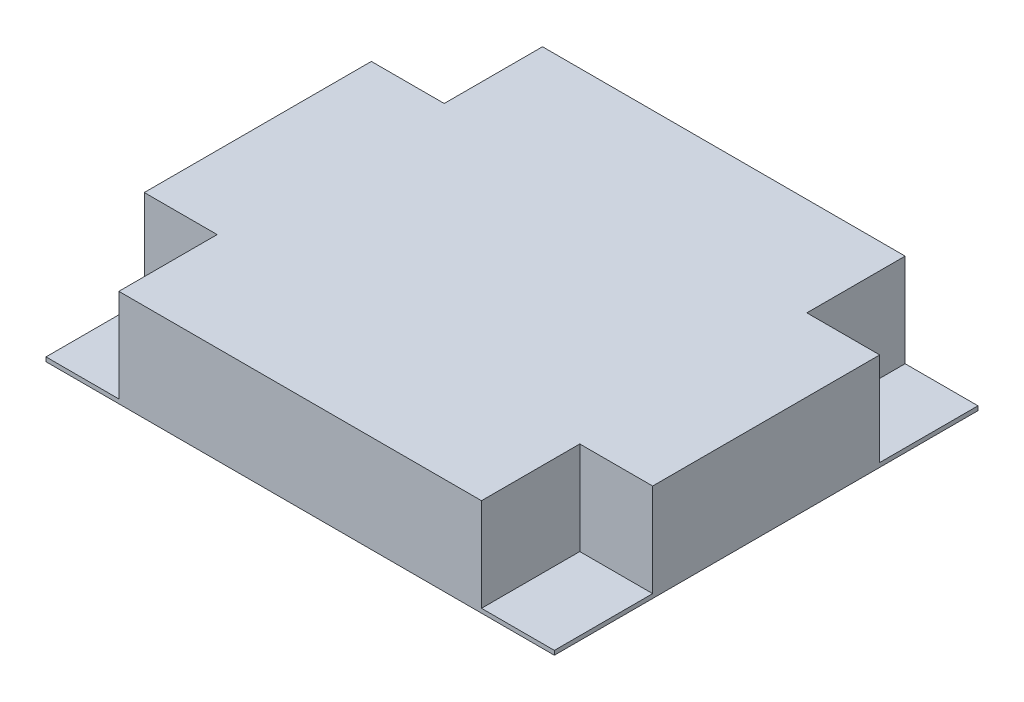
ISO-10303-21;
HEADER;
FILE_DESCRIPTION(('STEP AP214'),'2;1');
FILE_NAME('part.step','',(''),(''),'','','');
FILE_SCHEMA(('AUTOMOTIVE_DESIGN { 1 0 10303 214 1 1 1 1 }'));
ENDSEC;
DATA;
#1=APPLICATION_CONTEXT('core data for automotive mechanical design processes');
#2=APPLICATION_PROTOCOL_DEFINITION('international standard','automotive_design',2000,#1);
#3=PRODUCT_CONTEXT('',#1,'mechanical');
#4=PRODUCT('Part','Part','',(#3));
#5=PRODUCT_RELATED_PRODUCT_CATEGORY('part','',(#4));
#6=PRODUCT_DEFINITION_FORMATION('','',#4);
#7=PRODUCT_DEFINITION_CONTEXT('part definition',#1,'design');
#8=PRODUCT_DEFINITION('design','',#6,#7);
#9=PRODUCT_DEFINITION_SHAPE('','',#8);
#10=(LENGTH_UNIT() NAMED_UNIT(*) SI_UNIT(.MILLI.,.METRE.));
#11=(NAMED_UNIT(*) PLANE_ANGLE_UNIT() SI_UNIT($,.RADIAN.));
#12=(NAMED_UNIT(*) SI_UNIT($,.STERADIAN.) SOLID_ANGLE_UNIT());
#13=UNCERTAINTY_MEASURE_WITH_UNIT(LENGTH_MEASURE(1.E-05),#10,'distance_accuracy_value','');
#14=(GEOMETRIC_REPRESENTATION_CONTEXT(3) GLOBAL_UNCERTAINTY_ASSIGNED_CONTEXT((#13)) GLOBAL_UNIT_ASSIGNED_CONTEXT((#10,
#11,#12)) REPRESENTATION_CONTEXT('',''));
#15=CARTESIAN_POINT('',(0.,0.,0.));
#16=DIRECTION('',(0.,0.,1.));
#17=DIRECTION('',(1.,0.,0.));
#18=AXIS2_PLACEMENT_3D('',#15,#16,#17);
#19=CARTESIAN_POINT('',(0.,115.,500.));
#20=DIRECTION('',(0.,0.,-1.));
#21=DIRECTION('',(-1.,0.,0.));
#22=AXIS2_PLACEMENT_3D('',#19,#20,#21);
#23=PLANE('',#22);
#24=DIRECTION('',(1.,0.,0.));
#25=VECTOR('',#24,1.);
#26=CARTESIAN_POINT('',(600.,5.,500.));
#27=LINE('',#26,#25);
#28=CARTESIAN_POINT('',(514.,5.,500.));
#29=VERTEX_POINT('',#28);
#30=CARTESIAN_POINT('',(600.,5.,500.));
#31=VERTEX_POINT('',#30);
#32=EDGE_CURVE('E206',#29,#31,#27,.T.);
#33=ORIENTED_EDGE('',*,*,#32,.F.);
#34=DIRECTION('',(0.,1.,0.));
#35=VECTOR('',#34,1.);
#36=CARTESIAN_POINT('',(514.,5.,500.));
#37=LINE('',#36,#35);
#38=CARTESIAN_POINT('',(514.,115.,500.));
#39=VERTEX_POINT('',#38);
#40=EDGE_CURVE('E187',#29,#39,#37,.T.);
#41=ORIENTED_EDGE('',*,*,#40,.T.);
#42=DIRECTION('',(1.,0.,0.));
#43=VECTOR('',#42,1.);
#44=CARTESIAN_POINT('',(0.,115.,500.));
#45=LINE('',#44,#43);
#46=CARTESIAN_POINT('',(86.,115.,500.));
#47=VERTEX_POINT('',#46);
#48=EDGE_CURVE('E241',#47,#39,#45,.T.);
#49=ORIENTED_EDGE('',*,*,#48,.F.);
#50=DIRECTION('',(0.,1.,0.));
#51=VECTOR('',#50,1.);
#52=CARTESIAN_POINT('',(86.,5.,500.));
#53=LINE('',#52,#51);
#54=CARTESIAN_POINT('',(86.,5.,500.));
#55=VERTEX_POINT('',#54);
#56=EDGE_CURVE('E230',#55,#47,#53,.T.);
#57=ORIENTED_EDGE('',*,*,#56,.F.);
#58=DIRECTION('',(1.,0.,0.));
#59=VECTOR('',#58,1.);
#60=CARTESIAN_POINT('',(0.,5.,500.));
#61=LINE('',#60,#59);
#62=CARTESIAN_POINT('',(0.,5.,500.));
#63=VERTEX_POINT('',#62);
#64=EDGE_CURVE('E220',#63,#55,#61,.T.);
#65=ORIENTED_EDGE('',*,*,#64,.F.);
#66=DIRECTION('',(0.,-1.,0.));
#67=VECTOR('',#66,1.);
#68=CARTESIAN_POINT('',(0.,115.,500.));
#69=LINE('',#68,#67);
#70=CARTESIAN_POINT('',(0.,0.,500.));
#71=VERTEX_POINT('',#70);
#72=EDGE_CURVE('E252',#63,#71,#69,.T.);
#73=ORIENTED_EDGE('',*,*,#72,.T.);
#74=DIRECTION('',(1.,0.,0.));
#75=VECTOR('',#74,1.);
#76=CARTESIAN_POINT('',(0.,0.,500.));
#77=LINE('',#76,#75);
#78=CARTESIAN_POINT('',(600.,0.,500.));
#79=VERTEX_POINT('',#78);
#80=EDGE_CURVE('E237',#71,#79,#77,.T.);
#81=ORIENTED_EDGE('',*,*,#80,.T.);
#82=DIRECTION('',(0.,-1.,0.));
#83=VECTOR('',#82,1.);
#84=CARTESIAN_POINT('',(600.,115.,500.));
#85=LINE('',#84,#83);
#86=EDGE_CURVE('E11',#31,#79,#85,.T.);
#87=ORIENTED_EDGE('',*,*,#86,.F.);
#88=EDGE_LOOP('',(#33,#41,#49,#57,#65,#73,#81,#87));
#89=FACE_BOUND('',#88,.T.);
#90=ADVANCED_FACE('F33',(#89),#23,.F.);
#91=CARTESIAN_POINT('',(600.,115.,0.));
#92=DIRECTION('',(1.,0.,0.));
#93=DIRECTION('',(0.,0.,-1.));
#94=AXIS2_PLACEMENT_3D('',#91,#92,#93);
#95=PLANE('',#94);
#96=DIRECTION('',(0.,1.,0.));
#97=VECTOR('',#96,1.);
#98=CARTESIAN_POINT('',(600.,5.,384.));
#99=LINE('',#98,#97);
#100=CARTESIAN_POINT('',(600.,5.,384.));
#101=VERTEX_POINT('',#100);
#102=CARTESIAN_POINT('',(600.,115.,384.));
#103=VERTEX_POINT('',#102);
#104=EDGE_CURVE('E208',#101,#103,#99,.T.);
#105=ORIENTED_EDGE('',*,*,#104,.F.);
#106=DIRECTION('',(0.,0.,-1.));
#107=VECTOR('',#106,1.);
#108=CARTESIAN_POINT('',(600.,5.,500.));
#109=LINE('',#108,#107);
#110=EDGE_CURVE('E196',#31,#101,#109,.T.);
#111=ORIENTED_EDGE('',*,*,#110,.F.);
#112=ORIENTED_EDGE('',*,*,#86,.T.);
#113=DIRECTION('',(0.,0.,1.));
#114=VECTOR('',#113,1.);
#115=CARTESIAN_POINT('',(600.,0.,0.));
#116=LINE('',#115,#114);
#117=CARTESIAN_POINT('',(600.,0.,0.));
#118=VERTEX_POINT('',#117);
#119=EDGE_CURVE('E255',#118,#79,#116,.T.);
#120=ORIENTED_EDGE('',*,*,#119,.F.);
#121=DIRECTION('',(0.,-1.,0.));
#122=VECTOR('',#121,1.);
#123=CARTESIAN_POINT('',(600.,115.,0.));
#124=LINE('',#123,#122);
#125=CARTESIAN_POINT('',(600.,5.,0.));
#126=VERTEX_POINT('',#125);
#127=EDGE_CURVE('E40',#126,#118,#124,.T.);
#128=ORIENTED_EDGE('',*,*,#127,.F.);
#129=DIRECTION('',(0.,0.,-1.));
#130=VECTOR('',#129,1.);
#131=CARTESIAN_POINT('',(600.,5.,0.));
#132=LINE('',#131,#130);
#133=CARTESIAN_POINT('',(600.,5.,116.));
#134=VERTEX_POINT('',#133);
#135=EDGE_CURVE('E183',#134,#126,#132,.T.);
#136=ORIENTED_EDGE('',*,*,#135,.F.);
#137=DIRECTION('',(0.,1.,0.));
#138=VECTOR('',#137,1.);
#139=CARTESIAN_POINT('',(600.,5.,116.));
#140=LINE('',#139,#138);
#141=CARTESIAN_POINT('',(600.,115.,116.));
#142=VERTEX_POINT('',#141);
#143=EDGE_CURVE('E189',#134,#142,#140,.T.);
#144=ORIENTED_EDGE('',*,*,#143,.T.);
#145=DIRECTION('',(0.,0.,1.));
#146=VECTOR('',#145,1.);
#147=CARTESIAN_POINT('',(600.,115.,0.));
#148=LINE('',#147,#146);
#149=EDGE_CURVE('E244',#142,#103,#148,.T.);
#150=ORIENTED_EDGE('',*,*,#149,.T.);
#151=EDGE_LOOP('',(#105,#111,#112,#120,#128,#136,#144,#150));
#152=FACE_BOUND('',#151,.T.);
#153=ADVANCED_FACE('F274',(#152),#95,.T.);
#154=CARTESIAN_POINT('',(0.,115.,0.));
#155=DIRECTION('',(0.,0.,-1.));
#156=DIRECTION('',(-1.,0.,0.));
#157=AXIS2_PLACEMENT_3D('',#154,#155,#156);
#158=PLANE('',#157);
#159=DIRECTION('',(0.,1.,0.));
#160=VECTOR('',#159,1.);
#161=CARTESIAN_POINT('',(514.,5.,1.11022302462516E-13));
#162=LINE('',#161,#160);
#163=CARTESIAN_POINT('',(514.,5.,1.11022302462516E-13));
#164=VERTEX_POINT('',#163);
#165=CARTESIAN_POINT('',(514.,115.,0.));
#166=VERTEX_POINT('',#165);
#167=EDGE_CURVE('E55',#164,#166,#162,.T.);
#168=ORIENTED_EDGE('',*,*,#167,.F.);
#169=DIRECTION('',(-1.,0.,0.));
#170=VECTOR('',#169,1.);
#171=CARTESIAN_POINT('',(600.,5.,0.));
#172=LINE('',#171,#170);
#173=EDGE_CURVE('E173',#126,#164,#172,.T.);
#174=ORIENTED_EDGE('',*,*,#173,.F.);
#175=ORIENTED_EDGE('',*,*,#127,.T.);
#176=DIRECTION('',(1.,0.,0.));
#177=VECTOR('',#176,1.);
#178=CARTESIAN_POINT('',(0.,0.,0.));
#179=LINE('',#178,#177);
#180=CARTESIAN_POINT('',(0.,0.,0.));
#181=VERTEX_POINT('',#180);
#182=EDGE_CURVE('E258',#181,#118,#179,.T.);
#183=ORIENTED_EDGE('',*,*,#182,.F.);
#184=DIRECTION('',(0.,-1.,0.));
#185=VECTOR('',#184,1.);
#186=CARTESIAN_POINT('',(0.,115.,0.));
#187=LINE('',#186,#185);
#188=CARTESIAN_POINT('',(0.,5.,0.));
#189=VERTEX_POINT('',#188);
#190=EDGE_CURVE('E264',#189,#181,#187,.T.);
#191=ORIENTED_EDGE('',*,*,#190,.F.);
#192=DIRECTION('',(-1.,0.,0.));
#193=VECTOR('',#192,1.);
#194=CARTESIAN_POINT('',(0.,5.,0.));
#195=LINE('',#194,#193);
#196=CARTESIAN_POINT('',(86.,5.,1.11022302462516E-13));
#197=VERTEX_POINT('',#196);
#198=EDGE_CURVE('E157',#197,#189,#195,.T.);
#199=ORIENTED_EDGE('',*,*,#198,.F.);
#200=DIRECTION('',(0.,1.,0.));
#201=VECTOR('',#200,1.);
#202=CARTESIAN_POINT('',(86.,5.,1.11022302462516E-13));
#203=LINE('',#202,#201);
#204=CARTESIAN_POINT('',(86.,115.,1.11022302462516E-13));
#205=VERTEX_POINT('',#204);
#206=EDGE_CURVE('E168',#197,#205,#203,.T.);
#207=ORIENTED_EDGE('',*,*,#206,.T.);
#208=DIRECTION('',(1.,0.,0.));
#209=VECTOR('',#208,1.);
#210=CARTESIAN_POINT('',(0.,115.,0.));
#211=LINE('',#210,#209);
#212=EDGE_CURVE('E248',#205,#166,#211,.T.);
#213=ORIENTED_EDGE('',*,*,#212,.T.);
#214=EDGE_LOOP('',(#168,#174,#175,#183,#191,#199,#207,#213));
#215=FACE_BOUND('',#214,.T.);
#216=ADVANCED_FACE('F270',(#215),#158,.T.);
#217=CARTESIAN_POINT('',(0.,115.,0.));
#218=DIRECTION('',(1.,0.,0.));
#219=DIRECTION('',(0.,0.,-1.));
#220=AXIS2_PLACEMENT_3D('',#217,#218,#219);
#221=PLANE('',#220);
#222=DIRECTION('',(0.,0.,1.));
#223=VECTOR('',#222,1.);
#224=CARTESIAN_POINT('',(0.,115.,0.));
#225=LINE('',#224,#223);
#226=CARTESIAN_POINT('',(0.,115.,116.));
#227=VERTEX_POINT('',#226);
#228=CARTESIAN_POINT('',(0.,115.,384.));
#229=VERTEX_POINT('',#228);
#230=EDGE_CURVE('E166',#227,#229,#225,.T.);
#231=ORIENTED_EDGE('',*,*,#230,.F.);
#232=DIRECTION('',(0.,1.,0.));
#233=VECTOR('',#232,1.);
#234=CARTESIAN_POINT('',(0.,5.,116.));
#235=LINE('',#234,#233);
#236=CARTESIAN_POINT('',(0.,5.,116.));
#237=VERTEX_POINT('',#236);
#238=EDGE_CURVE('E47',#237,#227,#235,.T.);
#239=ORIENTED_EDGE('',*,*,#238,.F.);
#240=DIRECTION('',(0.,0.,1.));
#241=VECTOR('',#240,1.);
#242=CARTESIAN_POINT('',(0.,5.,0.));
#243=LINE('',#242,#241);
#244=EDGE_CURVE('E152',#189,#237,#243,.T.);
#245=ORIENTED_EDGE('',*,*,#244,.F.);
#246=ORIENTED_EDGE('',*,*,#190,.T.);
#247=DIRECTION('',(0.,0.,1.));
#248=VECTOR('',#247,1.);
#249=CARTESIAN_POINT('',(0.,0.,0.));
#250=LINE('',#249,#248);
#251=EDGE_CURVE('E245',#181,#71,#250,.T.);
#252=ORIENTED_EDGE('',*,*,#251,.T.);
#253=ORIENTED_EDGE('',*,*,#72,.F.);
#254=DIRECTION('',(0.,0.,1.));
#255=VECTOR('',#254,1.);
#256=CARTESIAN_POINT('',(0.,5.,500.));
#257=LINE('',#256,#255);
#258=CARTESIAN_POINT('',(0.,5.,384.));
#259=VERTEX_POINT('',#258);
#260=EDGE_CURVE('E218',#259,#63,#257,.T.);
#261=ORIENTED_EDGE('',*,*,#260,.F.);
#262=DIRECTION('',(0.,1.,0.));
#263=VECTOR('',#262,1.);
#264=CARTESIAN_POINT('',(0.,5.,384.));
#265=LINE('',#264,#263);
#266=EDGE_CURVE('E235',#259,#229,#265,.T.);
#267=ORIENTED_EDGE('',*,*,#266,.T.);
#268=EDGE_LOOP('',(#231,#239,#245,#246,#252,#253,#261,#267));
#269=FACE_BOUND('',#268,.T.);
#270=ADVANCED_FACE('F163',(#269),#221,.F.);
#271=CARTESIAN_POINT('',(0.,115.,0.));
#272=DIRECTION('',(0.,-1.,0.));
#273=DIRECTION('',(0.,0.,-1.));
#274=AXIS2_PLACEMENT_3D('',#271,#272,#273);
#275=PLANE('',#274);
#276=ORIENTED_EDGE('',*,*,#48,.T.);
#277=DIRECTION('',(0.,0.,1.));
#278=VECTOR('',#277,1.);
#279=CARTESIAN_POINT('',(514.,115.,500.));
#280=LINE('',#279,#278);
#281=CARTESIAN_POINT('',(514.,115.,384.));
#282=VERTEX_POINT('',#281);
#283=EDGE_CURVE('E200',#282,#39,#280,.T.);
#284=ORIENTED_EDGE('',*,*,#283,.F.);
#285=DIRECTION('',(-1.,0.,0.));
#286=VECTOR('',#285,1.);
#287=CARTESIAN_POINT('',(600.,115.,384.));
#288=LINE('',#287,#286);
#289=EDGE_CURVE('E209',#103,#282,#288,.T.);
#290=ORIENTED_EDGE('',*,*,#289,.F.);
#291=ORIENTED_EDGE('',*,*,#149,.F.);
#292=DIRECTION('',(1.,0.,0.));
#293=VECTOR('',#292,1.);
#294=CARTESIAN_POINT('',(600.,115.,116.));
#295=LINE('',#294,#293);
#296=CARTESIAN_POINT('',(514.,115.,116.));
#297=VERTEX_POINT('',#296);
#298=EDGE_CURVE('E177',#297,#142,#295,.T.);
#299=ORIENTED_EDGE('',*,*,#298,.F.);
#300=DIRECTION('',(0.,0.,1.));
#301=VECTOR('',#300,1.);
#302=CARTESIAN_POINT('',(514.,115.,1.11022302462516E-13));
#303=LINE('',#302,#301);
#304=EDGE_CURVE('E185',#166,#297,#303,.T.);
#305=ORIENTED_EDGE('',*,*,#304,.F.);
#306=ORIENTED_EDGE('',*,*,#212,.F.);
#307=DIRECTION('',(0.,0.,-1.));
#308=VECTOR('',#307,1.);
#309=CARTESIAN_POINT('',(86.,115.,1.11022302462516E-13));
#310=LINE('',#309,#308);
#311=CARTESIAN_POINT('',(86.,115.,116.));
#312=VERTEX_POINT('',#311);
#313=EDGE_CURVE('E160',#312,#205,#310,.T.);
#314=ORIENTED_EDGE('',*,*,#313,.F.);
#315=DIRECTION('',(1.,0.,0.));
#316=VECTOR('',#315,1.);
#317=CARTESIAN_POINT('',(0.,115.,116.));
#318=LINE('',#317,#316);
#319=EDGE_CURVE('E192',#227,#312,#318,.T.);
#320=ORIENTED_EDGE('',*,*,#319,.F.);
#321=ORIENTED_EDGE('',*,*,#230,.T.);
#322=DIRECTION('',(-1.,0.,0.));
#323=VECTOR('',#322,1.);
#324=CARTESIAN_POINT('',(0.,115.,384.));
#325=LINE('',#324,#323);
#326=CARTESIAN_POINT('',(86.,115.,384.));
#327=VERTEX_POINT('',#326);
#328=EDGE_CURVE('E221',#327,#229,#325,.T.);
#329=ORIENTED_EDGE('',*,*,#328,.F.);
#330=DIRECTION('',(0.,0.,-1.));
#331=VECTOR('',#330,1.);
#332=CARTESIAN_POINT('',(86.,115.,500.));
#333=LINE('',#332,#331);
#334=EDGE_CURVE('E231',#47,#327,#333,.T.);
#335=ORIENTED_EDGE('',*,*,#334,.F.);
#336=EDGE_LOOP('',(#276,#284,#290,#291,#299,#305,#306,#314,#320,#321,#329,#335));
#337=FACE_BOUND('',#336,.T.);
#338=ADVANCED_FACE('F288',(#337),#275,.F.);
#339=CARTESIAN_POINT('',(0.,0.,0.));
#340=DIRECTION('',(0.,-1.,0.));
#341=DIRECTION('',(0.,0.,-1.));
#342=AXIS2_PLACEMENT_3D('',#339,#340,#341);
#343=PLANE('',#342);
#344=ORIENTED_EDGE('',*,*,#80,.F.);
#345=ORIENTED_EDGE('',*,*,#251,.F.);
#346=ORIENTED_EDGE('',*,*,#182,.T.);
#347=ORIENTED_EDGE('',*,*,#119,.T.);
#348=EDGE_LOOP('',(#344,#345,#346,#347));
#349=FACE_BOUND('',#348,.T.);
#350=ADVANCED_FACE('F280',(#349),#343,.T.);
#351=CARTESIAN_POINT('',(0.,5.,384.));
#352=DIRECTION('',(0.,0.,-1.));
#353=DIRECTION('',(-1.,0.,0.));
#354=AXIS2_PLACEMENT_3D('',#351,#352,#353);
#355=PLANE('',#354);
#356=ORIENTED_EDGE('',*,*,#328,.T.);
#357=ORIENTED_EDGE('',*,*,#266,.F.);
#358=DIRECTION('',(-1.,0.,0.));
#359=VECTOR('',#358,1.);
#360=CARTESIAN_POINT('',(0.,5.,384.));
#361=LINE('',#360,#359);
#362=CARTESIAN_POINT('',(86.,5.,384.));
#363=VERTEX_POINT('',#362);
#364=EDGE_CURVE('E227',#363,#259,#361,.T.);
#365=ORIENTED_EDGE('',*,*,#364,.F.);
#366=DIRECTION('',(0.,1.,0.));
#367=VECTOR('',#366,1.);
#368=CARTESIAN_POINT('',(86.,5.,384.));
#369=LINE('',#368,#367);
#370=EDGE_CURVE('E238',#363,#327,#369,.T.);
#371=ORIENTED_EDGE('',*,*,#370,.T.);
#372=EDGE_LOOP('',(#356,#357,#365,#371));
#373=FACE_BOUND('',#372,.T.);
#374=ADVANCED_FACE('F341',(#373),#355,.F.);
#375=CARTESIAN_POINT('',(86.,5.,500.));
#376=DIRECTION('',(1.,0.,0.));
#377=DIRECTION('',(0.,0.,-1.));
#378=AXIS2_PLACEMENT_3D('',#375,#376,#377);
#379=PLANE('',#378);
#380=ORIENTED_EDGE('',*,*,#334,.T.);
#381=ORIENTED_EDGE('',*,*,#370,.F.);
#382=DIRECTION('',(0.,0.,-1.));
#383=VECTOR('',#382,1.);
#384=CARTESIAN_POINT('',(86.,5.,500.));
#385=LINE('',#384,#383);
#386=EDGE_CURVE('E224',#55,#363,#385,.T.);
#387=ORIENTED_EDGE('',*,*,#386,.F.);
#388=ORIENTED_EDGE('',*,*,#56,.T.);
#389=EDGE_LOOP('',(#380,#381,#387,#388));
#390=FACE_BOUND('',#389,.T.);
#391=ADVANCED_FACE('F325',(#390),#379,.F.);
#392=CARTESIAN_POINT('',(0.,5.,0.));
#393=DIRECTION('',(0.,-1.,0.));
#394=DIRECTION('',(0.,0.,-1.));
#395=AXIS2_PLACEMENT_3D('',#392,#393,#394);
#396=PLANE('',#395);
#397=ORIENTED_EDGE('',*,*,#260,.T.);
#398=ORIENTED_EDGE('',*,*,#64,.T.);
#399=ORIENTED_EDGE('',*,*,#386,.T.);
#400=ORIENTED_EDGE('',*,*,#364,.T.);
#401=EDGE_LOOP('',(#397,#398,#399,#400));
#402=FACE_BOUND('',#401,.T.);
#403=ADVANCED_FACE('F309',(#402),#396,.F.);
#404=CARTESIAN_POINT('',(86.,5.,1.11022302462516E-13));
#405=DIRECTION('',(1.,0.,0.));
#406=DIRECTION('',(0.,0.,-1.));
#407=AXIS2_PLACEMENT_3D('',#404,#405,#406);
#408=PLANE('',#407);
#409=ORIENTED_EDGE('',*,*,#313,.T.);
#410=ORIENTED_EDGE('',*,*,#206,.F.);
#411=DIRECTION('',(0.,0.,-1.));
#412=VECTOR('',#411,1.);
#413=CARTESIAN_POINT('',(86.,5.,1.11022302462516E-13));
#414=LINE('',#413,#412);
#415=CARTESIAN_POINT('',(86.,5.,116.));
#416=VERTEX_POINT('',#415);
#417=EDGE_CURVE('E151',#416,#197,#414,.T.);
#418=ORIENTED_EDGE('',*,*,#417,.F.);
#419=DIRECTION('',(0.,1.,0.));
#420=VECTOR('',#419,1.);
#421=CARTESIAN_POINT('',(86.,5.,116.));
#422=LINE('',#421,#420);
#423=EDGE_CURVE('E147',#416,#312,#422,.T.);
#424=ORIENTED_EDGE('',*,*,#423,.T.);
#425=EDGE_LOOP('',(#409,#410,#418,#424));
#426=FACE_BOUND('',#425,.T.);
#427=ADVANCED_FACE('F317',(#426),#408,.F.);
#428=CARTESIAN_POINT('',(0.,5.,116.));
#429=DIRECTION('',(0.,0.,1.));
#430=DIRECTION('',(1.,0.,0.));
#431=AXIS2_PLACEMENT_3D('',#428,#429,#430);
#432=PLANE('',#431);
#433=ORIENTED_EDGE('',*,*,#319,.T.);
#434=ORIENTED_EDGE('',*,*,#423,.F.);
#435=DIRECTION('',(1.,0.,0.));
#436=VECTOR('',#435,1.);
#437=CARTESIAN_POINT('',(0.,5.,116.));
#438=LINE('',#437,#436);
#439=EDGE_CURVE('E144',#237,#416,#438,.T.);
#440=ORIENTED_EDGE('',*,*,#439,.F.);
#441=ORIENTED_EDGE('',*,*,#238,.T.);
#442=EDGE_LOOP('',(#433,#434,#440,#441));
#443=FACE_BOUND('',#442,.T.);
#444=ADVANCED_FACE('F146',(#443),#432,.F.);
#445=CARTESIAN_POINT('',(0.,5.,0.));
#446=DIRECTION('',(0.,1.,0.));
#447=DIRECTION('',(0.,0.,1.));
#448=AXIS2_PLACEMENT_3D('',#445,#446,#447);
#449=PLANE('',#448);
#450=ORIENTED_EDGE('',*,*,#244,.T.);
#451=ORIENTED_EDGE('',*,*,#439,.T.);
#452=ORIENTED_EDGE('',*,*,#417,.T.);
#453=ORIENTED_EDGE('',*,*,#198,.T.);
#454=EDGE_LOOP('',(#450,#451,#452,#453));
#455=FACE_BOUND('',#454,.T.);
#456=ADVANCED_FACE('F155',(#455),#449,.T.);
#457=CARTESIAN_POINT('',(600.,5.,116.));
#458=DIRECTION('',(0.,0.,1.));
#459=DIRECTION('',(1.,0.,0.));
#460=AXIS2_PLACEMENT_3D('',#457,#458,#459);
#461=PLANE('',#460);
#462=ORIENTED_EDGE('',*,*,#298,.T.);
#463=ORIENTED_EDGE('',*,*,#143,.F.);
#464=DIRECTION('',(1.,0.,0.));
#465=VECTOR('',#464,1.);
#466=CARTESIAN_POINT('',(600.,5.,116.));
#467=LINE('',#466,#465);
#468=CARTESIAN_POINT('',(514.,5.,116.));
#469=VERTEX_POINT('',#468);
#470=EDGE_CURVE('E180',#469,#134,#467,.T.);
#471=ORIENTED_EDGE('',*,*,#470,.F.);
#472=DIRECTION('',(0.,1.,0.));
#473=VECTOR('',#472,1.);
#474=CARTESIAN_POINT('',(514.,5.,116.));
#475=LINE('',#474,#473);
#476=EDGE_CURVE('E193',#469,#297,#475,.T.);
#477=ORIENTED_EDGE('',*,*,#476,.T.);
#478=EDGE_LOOP('',(#462,#463,#471,#477));
#479=FACE_BOUND('',#478,.T.);
#480=ADVANCED_FACE('F294',(#479),#461,.F.);
#481=CARTESIAN_POINT('',(514.,5.,1.11022302462516E-13));
#482=DIRECTION('',(-1.,0.,0.));
#483=DIRECTION('',(0.,0.,1.));
#484=AXIS2_PLACEMENT_3D('',#481,#482,#483);
#485=PLANE('',#484);
#486=ORIENTED_EDGE('',*,*,#304,.T.);
#487=ORIENTED_EDGE('',*,*,#476,.F.);
#488=DIRECTION('',(0.,0.,1.));
#489=VECTOR('',#488,1.);
#490=CARTESIAN_POINT('',(514.,5.,1.11022302462516E-13));
#491=LINE('',#490,#489);
#492=EDGE_CURVE('E176',#164,#469,#491,.T.);
#493=ORIENTED_EDGE('',*,*,#492,.F.);
#494=ORIENTED_EDGE('',*,*,#167,.T.);
#495=EDGE_LOOP('',(#486,#487,#493,#494));
#496=FACE_BOUND('',#495,.T.);
#497=ADVANCED_FACE('F291',(#496),#485,.F.);
#498=CARTESIAN_POINT('',(0.,5.,0.));
#499=DIRECTION('',(0.,1.,0.));
#500=DIRECTION('',(0.,0.,1.));
#501=AXIS2_PLACEMENT_3D('',#498,#499,#500);
#502=PLANE('',#501);
#503=ORIENTED_EDGE('',*,*,#173,.T.);
#504=ORIENTED_EDGE('',*,*,#492,.T.);
#505=ORIENTED_EDGE('',*,*,#470,.T.);
#506=ORIENTED_EDGE('',*,*,#135,.T.);
#507=EDGE_LOOP('',(#503,#504,#505,#506));
#508=FACE_BOUND('',#507,.T.);
#509=ADVANCED_FACE('F296',(#508),#502,.T.);
#510=CARTESIAN_POINT('',(514.,5.,500.));
#511=DIRECTION('',(-1.,0.,0.));
#512=DIRECTION('',(0.,0.,1.));
#513=AXIS2_PLACEMENT_3D('',#510,#511,#512);
#514=PLANE('',#513);
#515=ORIENTED_EDGE('',*,*,#283,.T.);
#516=ORIENTED_EDGE('',*,*,#40,.F.);
#517=DIRECTION('',(0.,0.,1.));
#518=VECTOR('',#517,1.);
#519=CARTESIAN_POINT('',(514.,5.,500.));
#520=LINE('',#519,#518);
#521=CARTESIAN_POINT('',(514.,5.,384.));
#522=VERTEX_POINT('',#521);
#523=EDGE_CURVE('E203',#522,#29,#520,.T.);
#524=ORIENTED_EDGE('',*,*,#523,.F.);
#525=DIRECTION('',(0.,1.,0.));
#526=VECTOR('',#525,1.);
#527=CARTESIAN_POINT('',(514.,5.,384.));
#528=LINE('',#527,#526);
#529=EDGE_CURVE('E215',#522,#282,#528,.T.);
#530=ORIENTED_EDGE('',*,*,#529,.T.);
#531=EDGE_LOOP('',(#515,#516,#524,#530));
#532=FACE_BOUND('',#531,.T.);
#533=ADVANCED_FACE('F352',(#532),#514,.F.);
#534=CARTESIAN_POINT('',(600.,5.,384.));
#535=DIRECTION('',(0.,0.,-1.));
#536=DIRECTION('',(-1.,0.,0.));
#537=AXIS2_PLACEMENT_3D('',#534,#535,#536);
#538=PLANE('',#537);
#539=ORIENTED_EDGE('',*,*,#289,.T.);
#540=ORIENTED_EDGE('',*,*,#529,.F.);
#541=DIRECTION('',(-1.,0.,0.));
#542=VECTOR('',#541,1.);
#543=CARTESIAN_POINT('',(600.,5.,384.));
#544=LINE('',#543,#542);
#545=EDGE_CURVE('E199',#101,#522,#544,.T.);
#546=ORIENTED_EDGE('',*,*,#545,.F.);
#547=ORIENTED_EDGE('',*,*,#104,.T.);
#548=EDGE_LOOP('',(#539,#540,#546,#547));
#549=FACE_BOUND('',#548,.T.);
#550=ADVANCED_FACE('F300',(#549),#538,.F.);
#551=CARTESIAN_POINT('',(0.,5.,0.));
#552=DIRECTION('',(0.,1.,0.));
#553=DIRECTION('',(0.,0.,1.));
#554=AXIS2_PLACEMENT_3D('',#551,#552,#553);
#555=PLANE('',#554);
#556=ORIENTED_EDGE('',*,*,#110,.T.);
#557=ORIENTED_EDGE('',*,*,#545,.T.);
#558=ORIENTED_EDGE('',*,*,#523,.T.);
#559=ORIENTED_EDGE('',*,*,#32,.T.);
#560=EDGE_LOOP('',(#556,#557,#558,#559));
#561=FACE_BOUND('',#560,.T.);
#562=ADVANCED_FACE('F351',(#561),#555,.T.);
#563=CLOSED_SHELL('',(#90,#153,#216,#270,#338,#350,#374,#391,#403,#427,#444,#456,#480,#497,#509,
#533,#550,#562));
#564=MANIFOLD_SOLID_BREP('B2',#563);
#565=ADVANCED_BREP_SHAPE_REPRESENTATION('',(#18,#564),#14);
#566=SHAPE_DEFINITION_REPRESENTATION(#9,#565);
ENDSEC;
END-ISO-10303-21;
